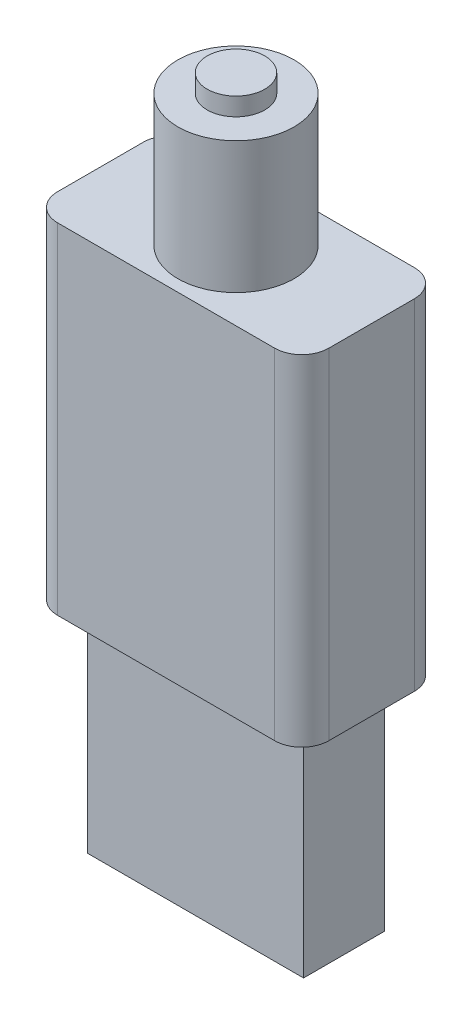
ISO-10303-21;
HEADER;
FILE_DESCRIPTION(('STEP AP214'),'2;1');
FILE_NAME('part.step','',(''),(''),'','','');
FILE_SCHEMA(('AUTOMOTIVE_DESIGN { 1 0 10303 214 1 1 1 1 }'));
ENDSEC;
DATA;
#1=APPLICATION_CONTEXT('core data for automotive mechanical design processes');
#2=APPLICATION_PROTOCOL_DEFINITION('international standard','automotive_design',2000,#1);
#3=PRODUCT_CONTEXT('',#1,'mechanical');
#4=PRODUCT('Part','Part','',(#3));
#5=PRODUCT_RELATED_PRODUCT_CATEGORY('part','',(#4));
#6=PRODUCT_DEFINITION_FORMATION('','',#4);
#7=PRODUCT_DEFINITION_CONTEXT('part definition',#1,'design');
#8=PRODUCT_DEFINITION('design','',#6,#7);
#9=PRODUCT_DEFINITION_SHAPE('','',#8);
#10=(LENGTH_UNIT() NAMED_UNIT(*) SI_UNIT(.MILLI.,.METRE.));
#11=(NAMED_UNIT(*) PLANE_ANGLE_UNIT() SI_UNIT($,.RADIAN.));
#12=(NAMED_UNIT(*) SI_UNIT($,.STERADIAN.) SOLID_ANGLE_UNIT());
#13=UNCERTAINTY_MEASURE_WITH_UNIT(LENGTH_MEASURE(1.E-05),#10,'distance_accuracy_value','');
#14=(GEOMETRIC_REPRESENTATION_CONTEXT(3) GLOBAL_UNCERTAINTY_ASSIGNED_CONTEXT((#13)) GLOBAL_UNIT_ASSIGNED_CONTEXT((#10,
#11,#12)) REPRESENTATION_CONTEXT('',''));
#15=CARTESIAN_POINT('',(0.,0.,0.));
#16=DIRECTION('',(0.,0.,1.));
#17=DIRECTION('',(1.,0.,0.));
#18=AXIS2_PLACEMENT_3D('',#15,#16,#17);
#19=CARTESIAN_POINT('',(6.,12.23,2.25));
#20=DIRECTION('',(-1.,0.,0.));
#21=DIRECTION('',(0.,0.,1.));
#22=AXIS2_PLACEMENT_3D('',#19,#20,#21);
#23=PLANE('',#22);
#24=DIRECTION('',(0.,0.,-1.));
#25=VECTOR('',#24,1.);
#26=CARTESIAN_POINT('',(6.,0.,2.25));
#27=LINE('',#26,#25);
#28=CARTESIAN_POINT('',(6.,0.,2.25));
#29=VERTEX_POINT('',#28);
#30=CARTESIAN_POINT('',(6.,0.,-2.25));
#31=VERTEX_POINT('',#30);
#32=EDGE_CURVE('E156',#29,#31,#27,.T.);
#33=ORIENTED_EDGE('',*,*,#32,.T.);
#34=DIRECTION('',(0.,-1.,0.));
#35=VECTOR('',#34,1.);
#36=CARTESIAN_POINT('',(6.,12.23,-2.25));
#37=LINE('',#36,#35);
#38=CARTESIAN_POINT('',(6.,12.23,-2.25));
#39=VERTEX_POINT('',#38);
#40=EDGE_CURVE('E182',#39,#31,#37,.T.);
#41=ORIENTED_EDGE('',*,*,#40,.F.);
#42=DIRECTION('',(0.,0.,-1.));
#43=VECTOR('',#42,1.);
#44=CARTESIAN_POINT('',(6.,12.23,2.25));
#45=LINE('',#44,#43);
#46=CARTESIAN_POINT('',(6.,12.23,2.25));
#47=VERTEX_POINT('',#46);
#48=EDGE_CURVE('E165',#47,#39,#45,.T.);
#49=ORIENTED_EDGE('',*,*,#48,.F.);
#50=DIRECTION('',(0.,-1.,0.));
#51=VECTOR('',#50,1.);
#52=CARTESIAN_POINT('',(6.,12.23,2.25));
#53=LINE('',#52,#51);
#54=EDGE_CURVE('E174',#47,#29,#53,.T.);
#55=ORIENTED_EDGE('',*,*,#54,.T.);
#56=EDGE_LOOP('',(#33,#41,#49,#55));
#57=FACE_BOUND('',#56,.T.);
#58=ADVANCED_FACE('F32',(#57),#23,.F.);
#59=CARTESIAN_POINT('',(-6.,12.23,-2.25));
#60=DIRECTION('',(0.,0.,1.));
#61=DIRECTION('',(1.,0.,0.));
#62=AXIS2_PLACEMENT_3D('',#59,#60,#61);
#63=PLANE('',#62);
#64=DIRECTION('',(-1.,0.,0.));
#65=VECTOR('',#64,1.);
#66=CARTESIAN_POINT('',(-6.,0.,-2.25));
#67=LINE('',#66,#65);
#68=CARTESIAN_POINT('',(-6.,0.,-2.25));
#69=VERTEX_POINT('',#68);
#70=EDGE_CURVE('E159',#31,#69,#67,.T.);
#71=ORIENTED_EDGE('',*,*,#70,.T.);
#72=DIRECTION('',(0.,-1.,0.));
#73=VECTOR('',#72,1.);
#74=CARTESIAN_POINT('',(-6.,12.23,-2.25));
#75=LINE('',#74,#73);
#76=CARTESIAN_POINT('',(-6.,12.23,-2.25));
#77=VERTEX_POINT('',#76);
#78=EDGE_CURVE('E181',#77,#69,#75,.T.);
#79=ORIENTED_EDGE('',*,*,#78,.F.);
#80=DIRECTION('',(-1.,0.,0.));
#81=VECTOR('',#80,1.);
#82=CARTESIAN_POINT('',(-6.,12.23,-2.25));
#83=LINE('',#82,#81);
#84=EDGE_CURVE('E76',#39,#77,#83,.T.);
#85=ORIENTED_EDGE('',*,*,#84,.F.);
#86=ORIENTED_EDGE('',*,*,#40,.T.);
#87=EDGE_LOOP('',(#71,#79,#85,#86));
#88=FACE_BOUND('',#87,.T.);
#89=ADVANCED_FACE('F203',(#88),#63,.F.);
#90=CARTESIAN_POINT('',(-6.,12.23,2.25));
#91=DIRECTION('',(1.,0.,0.));
#92=DIRECTION('',(0.,0.,-1.));
#93=AXIS2_PLACEMENT_3D('',#90,#91,#92);
#94=PLANE('',#93);
#95=DIRECTION('',(0.,0.,1.));
#96=VECTOR('',#95,1.);
#97=CARTESIAN_POINT('',(-6.,0.,2.25));
#98=LINE('',#97,#96);
#99=CARTESIAN_POINT('',(-6.,0.,2.25));
#100=VERTEX_POINT('',#99);
#101=EDGE_CURVE('E65',#69,#100,#98,.T.);
#102=ORIENTED_EDGE('',*,*,#101,.T.);
#103=DIRECTION('',(0.,-1.,0.));
#104=VECTOR('',#103,1.);
#105=CARTESIAN_POINT('',(-6.,12.23,2.25));
#106=LINE('',#105,#104);
#107=CARTESIAN_POINT('',(-6.,12.23,2.25));
#108=VERTEX_POINT('',#107);
#109=EDGE_CURVE('E49',#108,#100,#106,.T.);
#110=ORIENTED_EDGE('',*,*,#109,.F.);
#111=DIRECTION('',(0.,0.,1.));
#112=VECTOR('',#111,1.);
#113=CARTESIAN_POINT('',(-6.,12.23,2.25));
#114=LINE('',#113,#112);
#115=EDGE_CURVE('E169',#77,#108,#114,.T.);
#116=ORIENTED_EDGE('',*,*,#115,.F.);
#117=ORIENTED_EDGE('',*,*,#78,.T.);
#118=EDGE_LOOP('',(#102,#110,#116,#117));
#119=FACE_BOUND('',#118,.T.);
#120=ADVANCED_FACE('F208',(#119),#94,.F.);
#121=CARTESIAN_POINT('',(-6.,12.23,2.25));
#122=DIRECTION('',(0.,0.,-1.));
#123=DIRECTION('',(-1.,0.,0.));
#124=AXIS2_PLACEMENT_3D('',#121,#122,#123);
#125=PLANE('',#124);
#126=DIRECTION('',(1.,0.,0.));
#127=VECTOR('',#126,1.);
#128=CARTESIAN_POINT('',(-6.,0.,2.25));
#129=LINE('',#128,#127);
#130=EDGE_CURVE('E70',#100,#29,#129,.T.);
#131=ORIENTED_EDGE('',*,*,#130,.T.);
#132=ORIENTED_EDGE('',*,*,#54,.F.);
#133=DIRECTION('',(1.,0.,0.));
#134=VECTOR('',#133,1.);
#135=CARTESIAN_POINT('',(-6.,12.23,2.25));
#136=LINE('',#135,#134);
#137=EDGE_CURVE('E172',#108,#47,#136,.T.);
#138=ORIENTED_EDGE('',*,*,#137,.F.);
#139=ORIENTED_EDGE('',*,*,#109,.T.);
#140=EDGE_LOOP('',(#131,#132,#138,#139));
#141=FACE_BOUND('',#140,.T.);
#142=ADVANCED_FACE('F213',(#141),#125,.F.);
#143=CARTESIAN_POINT('',(0.,0.,0.));
#144=DIRECTION('',(0.,-1.,0.));
#145=DIRECTION('',(0.,0.,-1.));
#146=AXIS2_PLACEMENT_3D('',#143,#144,#145);
#147=PLANE('',#146);
#148=ORIENTED_EDGE('',*,*,#32,.F.);
#149=ORIENTED_EDGE('',*,*,#130,.F.);
#150=ORIENTED_EDGE('',*,*,#101,.F.);
#151=ORIENTED_EDGE('',*,*,#70,.F.);
#152=EDGE_LOOP('',(#148,#149,#150,#151));
#153=FACE_BOUND('',#152,.T.);
#154=ADVANCED_FACE('F211',(#153),#147,.T.);
#155=CARTESIAN_POINT('',(-6.025,31.1,2.375));
#156=DIRECTION('',(0.,-1.,0.));
#157=DIRECTION('',(0.,0.,-1.));
#158=AXIS2_PLACEMENT_3D('',#155,#156,#157);
#159=CYLINDRICAL_SURFACE('',#158,1.5);
#160=CARTESIAN_POINT('',(-6.025,12.23,2.375));
#161=DIRECTION('',(0.,1.,0.));
#162=DIRECTION('',(0.,0.,-1.));
#163=AXIS2_PLACEMENT_3D('',#160,#161,#162);
#164=CIRCLE('',#163,1.5);
#165=CARTESIAN_POINT('',(-7.525,12.23,2.37499999999999));
#166=VERTEX_POINT('',#165);
#167=CARTESIAN_POINT('',(-6.02499999999999,12.23,3.875));
#168=VERTEX_POINT('',#167);
#169=EDGE_CURVE('E155',#166,#168,#164,.T.);
#170=ORIENTED_EDGE('',*,*,#169,.T.);
#171=DIRECTION('',(0.,-1.,0.));
#172=VECTOR('',#171,1.);
#173=CARTESIAN_POINT('',(-6.02499999999999,31.1,3.875));
#174=LINE('',#173,#172);
#175=CARTESIAN_POINT('',(-6.02499999999999,31.1,3.875));
#176=VERTEX_POINT('',#175);
#177=EDGE_CURVE('E135',#176,#168,#174,.T.);
#178=ORIENTED_EDGE('',*,*,#177,.F.);
#179=CARTESIAN_POINT('',(-6.025,31.1,2.375));
#180=DIRECTION('',(0.,1.,0.));
#181=DIRECTION('',(0.,0.,-1.));
#182=AXIS2_PLACEMENT_3D('',#179,#180,#181);
#183=CIRCLE('',#182,1.5);
#184=CARTESIAN_POINT('',(-7.525,31.1,2.37499999999999));
#185=VERTEX_POINT('',#184);
#186=EDGE_CURVE('E142',#185,#176,#183,.T.);
#187=ORIENTED_EDGE('',*,*,#186,.F.);
#188=DIRECTION('',(0.,-1.,0.));
#189=VECTOR('',#188,1.);
#190=CARTESIAN_POINT('',(-7.525,31.1,2.37499999999999));
#191=LINE('',#190,#189);
#192=EDGE_CURVE('E260',#185,#166,#191,.T.);
#193=ORIENTED_EDGE('',*,*,#192,.T.);
#194=EDGE_LOOP('',(#170,#178,#187,#193));
#195=FACE_BOUND('',#194,.T.);
#196=ADVANCED_FACE('F153',(#195),#159,.T.);
#197=CARTESIAN_POINT('',(-6.02499999999999,31.1,3.875));
#198=DIRECTION('',(0.,0.,-1.));
#199=DIRECTION('',(-1.,0.,0.));
#200=AXIS2_PLACEMENT_3D('',#197,#198,#199);
#201=PLANE('',#200);
#202=DIRECTION('',(1.,0.,0.));
#203=VECTOR('',#202,1.);
#204=CARTESIAN_POINT('',(-6.02499999999999,12.23,3.875));
#205=LINE('',#204,#203);
#206=CARTESIAN_POINT('',(6.02499999999999,12.23,3.875));
#207=VERTEX_POINT('',#206);
#208=EDGE_CURVE('E285',#168,#207,#205,.T.);
#209=ORIENTED_EDGE('',*,*,#208,.T.);
#210=DIRECTION('',(0.,-1.,0.));
#211=VECTOR('',#210,1.);
#212=CARTESIAN_POINT('',(6.02499999999999,31.1,3.875));
#213=LINE('',#212,#211);
#214=CARTESIAN_POINT('',(6.02499999999999,31.1,3.875));
#215=VERTEX_POINT('',#214);
#216=EDGE_CURVE('E138',#215,#207,#213,.T.);
#217=ORIENTED_EDGE('',*,*,#216,.F.);
#218=DIRECTION('',(1.,0.,0.));
#219=VECTOR('',#218,1.);
#220=CARTESIAN_POINT('',(-6.02499999999999,31.1,3.875));
#221=LINE('',#220,#219);
#222=EDGE_CURVE('E131',#176,#215,#221,.T.);
#223=ORIENTED_EDGE('',*,*,#222,.F.);
#224=ORIENTED_EDGE('',*,*,#177,.T.);
#225=EDGE_LOOP('',(#209,#217,#223,#224));
#226=FACE_BOUND('',#225,.T.);
#227=ADVANCED_FACE('F133',(#226),#201,.F.);
#228=CARTESIAN_POINT('',(6.025,31.1,2.375));
#229=DIRECTION('',(0.,-1.,0.));
#230=DIRECTION('',(0.,0.,-1.));
#231=AXIS2_PLACEMENT_3D('',#228,#229,#230);
#232=CYLINDRICAL_SURFACE('',#231,1.5);
#233=CARTESIAN_POINT('',(6.025,12.23,2.375));
#234=DIRECTION('',(0.,1.,0.));
#235=DIRECTION('',(0.,0.,1.));
#236=AXIS2_PLACEMENT_3D('',#233,#234,#235);
#237=CIRCLE('',#236,1.5);
#238=CARTESIAN_POINT('',(7.525,12.23,2.37499999999999));
#239=VERTEX_POINT('',#238);
#240=EDGE_CURVE('E281',#207,#239,#237,.T.);
#241=ORIENTED_EDGE('',*,*,#240,.T.);
#242=DIRECTION('',(0.,-1.,0.));
#243=VECTOR('',#242,1.);
#244=CARTESIAN_POINT('',(7.525,31.1,2.37499999999999));
#245=LINE('',#244,#243);
#246=CARTESIAN_POINT('',(7.525,31.1,2.37499999999999));
#247=VERTEX_POINT('',#246);
#248=EDGE_CURVE('E161',#247,#239,#245,.T.);
#249=ORIENTED_EDGE('',*,*,#248,.F.);
#250=CARTESIAN_POINT('',(6.025,31.1,2.375));
#251=DIRECTION('',(0.,1.,0.));
#252=DIRECTION('',(0.,0.,1.));
#253=AXIS2_PLACEMENT_3D('',#250,#251,#252);
#254=CIRCLE('',#253,1.5);
#255=EDGE_CURVE('E141',#215,#247,#254,.T.);
#256=ORIENTED_EDGE('',*,*,#255,.F.);
#257=ORIENTED_EDGE('',*,*,#216,.T.);
#258=EDGE_LOOP('',(#241,#249,#256,#257));
#259=FACE_BOUND('',#258,.T.);
#260=ADVANCED_FACE('F227',(#259),#232,.T.);
#261=CARTESIAN_POINT('',(7.525,31.1,2.37499999999999));
#262=DIRECTION('',(-1.,0.,0.));
#263=DIRECTION('',(0.,0.,1.));
#264=AXIS2_PLACEMENT_3D('',#261,#262,#263);
#265=PLANE('',#264);
#266=DIRECTION('',(0.,0.,-1.));
#267=VECTOR('',#266,1.);
#268=CARTESIAN_POINT('',(7.525,12.23,2.37499999999999));
#269=LINE('',#268,#267);
#270=CARTESIAN_POINT('',(7.525,12.23,-2.37499999999999));
#271=VERTEX_POINT('',#270);
#272=EDGE_CURVE('E277',#239,#271,#269,.T.);
#273=ORIENTED_EDGE('',*,*,#272,.T.);
#274=DIRECTION('',(0.,-1.,0.));
#275=VECTOR('',#274,1.);
#276=CARTESIAN_POINT('',(7.525,31.1,-2.37499999999999));
#277=LINE('',#276,#275);
#278=CARTESIAN_POINT('',(7.525,31.1,-2.37499999999999));
#279=VERTEX_POINT('',#278);
#280=EDGE_CURVE('E270',#279,#271,#277,.T.);
#281=ORIENTED_EDGE('',*,*,#280,.F.);
#282=DIRECTION('',(0.,0.,-1.));
#283=VECTOR('',#282,1.);
#284=CARTESIAN_POINT('',(7.525,31.1,2.37499999999999));
#285=LINE('',#284,#283);
#286=EDGE_CURVE('E278',#247,#279,#285,.T.);
#287=ORIENTED_EDGE('',*,*,#286,.F.);
#288=ORIENTED_EDGE('',*,*,#248,.T.);
#289=EDGE_LOOP('',(#273,#281,#287,#288));
#290=FACE_BOUND('',#289,.T.);
#291=ADVANCED_FACE('F230',(#290),#265,.F.);
#292=CARTESIAN_POINT('',(6.025,31.1,-2.375));
#293=DIRECTION('',(0.,-1.,0.));
#294=DIRECTION('',(0.,0.,-1.));
#295=AXIS2_PLACEMENT_3D('',#292,#293,#294);
#296=CYLINDRICAL_SURFACE('',#295,1.5);
#297=CARTESIAN_POINT('',(6.025,12.23,-2.375));
#298=DIRECTION('',(0.,1.,0.));
#299=DIRECTION('',(0.,0.,-1.));
#300=AXIS2_PLACEMENT_3D('',#297,#298,#299);
#301=CIRCLE('',#300,1.5);
#302=CARTESIAN_POINT('',(6.02499999999999,12.23,-3.875));
#303=VERTEX_POINT('',#302);
#304=EDGE_CURVE('E282',#271,#303,#301,.T.);
#305=ORIENTED_EDGE('',*,*,#304,.T.);
#306=DIRECTION('',(0.,-1.,0.));
#307=VECTOR('',#306,1.);
#308=CARTESIAN_POINT('',(6.02499999999999,31.1,-3.875));
#309=LINE('',#308,#307);
#310=CARTESIAN_POINT('',(6.02499999999999,31.1,-3.875));
#311=VERTEX_POINT('',#310);
#312=EDGE_CURVE('E267',#311,#303,#309,.T.);
#313=ORIENTED_EDGE('',*,*,#312,.F.);
#314=CARTESIAN_POINT('',(6.025,31.1,-2.375));
#315=DIRECTION('',(0.,1.,0.));
#316=DIRECTION('',(0.,0.,-1.));
#317=AXIS2_PLACEMENT_3D('',#314,#315,#316);
#318=CIRCLE('',#317,1.5);
#319=EDGE_CURVE('E292',#279,#311,#318,.T.);
#320=ORIENTED_EDGE('',*,*,#319,.F.);
#321=ORIENTED_EDGE('',*,*,#280,.T.);
#322=EDGE_LOOP('',(#305,#313,#320,#321));
#323=FACE_BOUND('',#322,.T.);
#324=ADVANCED_FACE('F234',(#323),#296,.T.);
#325=CARTESIAN_POINT('',(-6.02499999999999,31.1,-3.875));
#326=DIRECTION('',(0.,0.,1.));
#327=DIRECTION('',(1.,0.,0.));
#328=AXIS2_PLACEMENT_3D('',#325,#326,#327);
#329=PLANE('',#328);
#330=DIRECTION('',(-1.,0.,0.));
#331=VECTOR('',#330,1.);
#332=CARTESIAN_POINT('',(-6.02499999999999,12.23,-3.875));
#333=LINE('',#332,#331);
#334=CARTESIAN_POINT('',(-6.02499999999999,12.23,-3.875));
#335=VERTEX_POINT('',#334);
#336=EDGE_CURVE('E258',#303,#335,#333,.T.);
#337=ORIENTED_EDGE('',*,*,#336,.T.);
#338=DIRECTION('',(0.,-1.,0.));
#339=VECTOR('',#338,1.);
#340=CARTESIAN_POINT('',(-6.02499999999999,31.1,-3.875));
#341=LINE('',#340,#339);
#342=CARTESIAN_POINT('',(-6.02499999999999,31.1,-3.875));
#343=VERTEX_POINT('',#342);
#344=EDGE_CURVE('E255',#343,#335,#341,.T.);
#345=ORIENTED_EDGE('',*,*,#344,.F.);
#346=DIRECTION('',(-1.,0.,0.));
#347=VECTOR('',#346,1.);
#348=CARTESIAN_POINT('',(-6.02499999999999,31.1,-3.875));
#349=LINE('',#348,#347);
#350=EDGE_CURVE('E290',#311,#343,#349,.T.);
#351=ORIENTED_EDGE('',*,*,#350,.F.);
#352=ORIENTED_EDGE('',*,*,#312,.T.);
#353=EDGE_LOOP('',(#337,#345,#351,#352));
#354=FACE_BOUND('',#353,.T.);
#355=ADVANCED_FACE('F238',(#354),#329,.F.);
#356=CARTESIAN_POINT('',(-6.025,31.1,-2.375));
#357=DIRECTION('',(0.,-1.,0.));
#358=DIRECTION('',(0.,0.,-1.));
#359=AXIS2_PLACEMENT_3D('',#356,#357,#358);
#360=CYLINDRICAL_SURFACE('',#359,1.5);
#361=CARTESIAN_POINT('',(-6.025,12.23,-2.375));
#362=DIRECTION('',(0.,1.,0.));
#363=DIRECTION('',(0.,0.,-1.));
#364=AXIS2_PLACEMENT_3D('',#361,#362,#363);
#365=CIRCLE('',#364,1.5);
#366=CARTESIAN_POINT('',(-7.525,12.23,-2.37499999999999));
#367=VERTEX_POINT('',#366);
#368=EDGE_CURVE('E250',#335,#367,#365,.T.);
#369=ORIENTED_EDGE('',*,*,#368,.T.);
#370=DIRECTION('',(0.,-1.,0.));
#371=VECTOR('',#370,1.);
#372=CARTESIAN_POINT('',(-7.525,31.1,-2.37499999999999));
#373=LINE('',#372,#371);
#374=CARTESIAN_POINT('',(-7.525,31.1,-2.37499999999999));
#375=VERTEX_POINT('',#374);
#376=EDGE_CURVE('E253',#375,#367,#373,.T.);
#377=ORIENTED_EDGE('',*,*,#376,.F.);
#378=CARTESIAN_POINT('',(-6.025,31.1,-2.375));
#379=DIRECTION('',(0.,1.,0.));
#380=DIRECTION('',(0.,0.,-1.));
#381=AXIS2_PLACEMENT_3D('',#378,#379,#380);
#382=CIRCLE('',#381,1.5);
#383=EDGE_CURVE('E294',#343,#375,#382,.T.);
#384=ORIENTED_EDGE('',*,*,#383,.F.);
#385=ORIENTED_EDGE('',*,*,#344,.T.);
#386=EDGE_LOOP('',(#369,#377,#384,#385));
#387=FACE_BOUND('',#386,.T.);
#388=ADVANCED_FACE('F198',(#387),#360,.T.);
#389=CARTESIAN_POINT('',(-7.525,31.1,2.37499999999999));
#390=DIRECTION('',(1.,0.,0.));
#391=DIRECTION('',(0.,0.,-1.));
#392=AXIS2_PLACEMENT_3D('',#389,#390,#391);
#393=PLANE('',#392);
#394=DIRECTION('',(0.,0.,1.));
#395=VECTOR('',#394,1.);
#396=CARTESIAN_POINT('',(-7.525,12.23,2.37499999999999));
#397=LINE('',#396,#395);
#398=EDGE_CURVE('E151',#367,#166,#397,.T.);
#399=ORIENTED_EDGE('',*,*,#398,.T.);
#400=ORIENTED_EDGE('',*,*,#192,.F.);
#401=DIRECTION('',(0.,0.,1.));
#402=VECTOR('',#401,1.);
#403=CARTESIAN_POINT('',(-7.525,31.1,2.37499999999999));
#404=LINE('',#403,#402);
#405=EDGE_CURVE('E147',#375,#185,#404,.T.);
#406=ORIENTED_EDGE('',*,*,#405,.F.);
#407=ORIENTED_EDGE('',*,*,#376,.T.);
#408=EDGE_LOOP('',(#399,#400,#406,#407));
#409=FACE_BOUND('',#408,.T.);
#410=ADVANCED_FACE('F190',(#409),#393,.F.);
#411=CARTESIAN_POINT('',(-6.025,31.1,2.375));
#412=DIRECTION('',(0.,-1.,0.));
#413=DIRECTION('',(0.,0.,-1.));
#414=AXIS2_PLACEMENT_3D('',#411,#412,#413);
#415=PLANE('',#414);
#416=CARTESIAN_POINT('',(0.,31.1,0.));
#417=DIRECTION('',(0.,-1.,0.));
#418=DIRECTION('',(0.,0.,-1.));
#419=AXIS2_PLACEMENT_3D('',#416,#417,#418);
#420=CIRCLE('',#419,3.225);
#421=CARTESIAN_POINT('',(0.,31.1,-3.225));
#422=VERTEX_POINT('',#421);
#423=EDGE_CURVE('E35',#422,#422,#420,.F.);
#424=ORIENTED_EDGE('',*,*,#423,.F.);
#425=EDGE_LOOP('',(#424));
#426=FACE_BOUND('',#425,.T.);
#427=ORIENTED_EDGE('',*,*,#186,.T.);
#428=ORIENTED_EDGE('',*,*,#222,.T.);
#429=ORIENTED_EDGE('',*,*,#255,.T.);
#430=ORIENTED_EDGE('',*,*,#286,.T.);
#431=ORIENTED_EDGE('',*,*,#319,.T.);
#432=ORIENTED_EDGE('',*,*,#350,.T.);
#433=ORIENTED_EDGE('',*,*,#383,.T.);
#434=ORIENTED_EDGE('',*,*,#405,.T.);
#435=EDGE_LOOP('',(#427,#428,#429,#430,#431,#432,#433,#434));
#436=FACE_BOUND('',#435,.T.);
#437=ADVANCED_FACE('F145',(#426,#436),#415,.F.);
#438=CARTESIAN_POINT('',(-6.025,12.23,2.375));
#439=DIRECTION('',(0.,-1.,0.));
#440=DIRECTION('',(0.,0.,-1.));
#441=AXIS2_PLACEMENT_3D('',#438,#439,#440);
#442=PLANE('',#441);
#443=ORIENTED_EDGE('',*,*,#137,.T.);
#444=ORIENTED_EDGE('',*,*,#48,.T.);
#445=ORIENTED_EDGE('',*,*,#84,.T.);
#446=ORIENTED_EDGE('',*,*,#115,.T.);
#447=EDGE_LOOP('',(#443,#444,#445,#446));
#448=FACE_BOUND('',#447,.T.);
#449=ORIENTED_EDGE('',*,*,#169,.F.);
#450=ORIENTED_EDGE('',*,*,#398,.F.);
#451=ORIENTED_EDGE('',*,*,#368,.F.);
#452=ORIENTED_EDGE('',*,*,#336,.F.);
#453=ORIENTED_EDGE('',*,*,#304,.F.);
#454=ORIENTED_EDGE('',*,*,#272,.F.);
#455=ORIENTED_EDGE('',*,*,#240,.F.);
#456=ORIENTED_EDGE('',*,*,#208,.F.);
#457=EDGE_LOOP('',(#449,#450,#451,#452,#453,#454,#455,#456));
#458=FACE_BOUND('',#457,.T.);
#459=ADVANCED_FACE('F189',(#448,#458),#442,.T.);
#460=CARTESIAN_POINT('',(0.,38.4,0.));
#461=DIRECTION('',(0.,-1.,0.));
#462=DIRECTION('',(0.,0.,-1.));
#463=AXIS2_PLACEMENT_3D('',#460,#461,#462);
#464=CYLINDRICAL_SURFACE('',#463,3.225);
#465=CARTESIAN_POINT('',(0.,38.4,0.));
#466=DIRECTION('',(0.,1.,0.));
#467=DIRECTION('',(0.,0.,1.));
#468=AXIS2_PLACEMENT_3D('',#465,#466,#467);
#469=CIRCLE('',#468,3.225);
#470=CARTESIAN_POINT('',(0.,38.4,3.225));
#471=VERTEX_POINT('',#470);
#472=EDGE_CURVE('E301',#471,#471,#469,.T.);
#473=ORIENTED_EDGE('',*,*,#472,.F.);
#474=EDGE_LOOP('',(#473));
#475=FACE_BOUND('',#474,.T.);
#476=ORIENTED_EDGE('',*,*,#423,.T.);
#477=EDGE_LOOP('',(#476));
#478=FACE_BOUND('',#477,.T.);
#479=ADVANCED_FACE('F186',(#475,#478),#464,.T.);
#480=CARTESIAN_POINT('',(0.,38.4,0.));
#481=DIRECTION('',(0.,1.,0.));
#482=DIRECTION('',(0.,0.,1.));
#483=AXIS2_PLACEMENT_3D('',#480,#481,#482);
#484=PLANE('',#483);
#485=CARTESIAN_POINT('',(0.,38.4,0.));
#486=DIRECTION('',(0.,1.,0.));
#487=DIRECTION('',(0.,0.,1.));
#488=AXIS2_PLACEMENT_3D('',#485,#486,#487);
#489=CIRCLE('',#488,1.6);
#490=CARTESIAN_POINT('',(0.,38.4,1.6));
#491=VERTEX_POINT('',#490);
#492=EDGE_CURVE('E11',#491,#491,#489,.T.);
#493=ORIENTED_EDGE('',*,*,#492,.F.);
#494=EDGE_LOOP('',(#493));
#495=FACE_BOUND('',#494,.T.);
#496=ORIENTED_EDGE('',*,*,#472,.T.);
#497=EDGE_LOOP('',(#496));
#498=FACE_BOUND('',#497,.T.);
#499=ADVANCED_FACE('F314',(#495,#498),#484,.T.);
#500=CARTESIAN_POINT('',(0.,39.4,0.));
#501=DIRECTION('',(0.,-1.,0.));
#502=DIRECTION('',(0.,0.,-1.));
#503=AXIS2_PLACEMENT_3D('',#500,#501,#502);
#504=CYLINDRICAL_SURFACE('',#503,1.6);
#505=CARTESIAN_POINT('',(0.,39.4,0.));
#506=DIRECTION('',(0.,1.,0.));
#507=DIRECTION('',(0.,0.,1.));
#508=AXIS2_PLACEMENT_3D('',#505,#506,#507);
#509=CIRCLE('',#508,1.6);
#510=CARTESIAN_POINT('',(0.,39.4,1.6));
#511=VERTEX_POINT('',#510);
#512=EDGE_CURVE('E304',#511,#511,#509,.T.);
#513=ORIENTED_EDGE('',*,*,#512,.F.);
#514=EDGE_LOOP('',(#513));
#515=FACE_BOUND('',#514,.T.);
#516=ORIENTED_EDGE('',*,*,#492,.T.);
#517=EDGE_LOOP('',(#516));
#518=FACE_BOUND('',#517,.T.);
#519=ADVANCED_FACE('F311',(#515,#518),#504,.T.);
#520=CARTESIAN_POINT('',(0.,39.4,0.));
#521=DIRECTION('',(0.,1.,0.));
#522=DIRECTION('',(0.,0.,1.));
#523=AXIS2_PLACEMENT_3D('',#520,#521,#522);
#524=PLANE('',#523);
#525=ORIENTED_EDGE('',*,*,#512,.T.);
#526=EDGE_LOOP('',(#525));
#527=FACE_BOUND('',#526,.T.);
#528=ADVANCED_FACE('F309',(#527),#524,.T.);
#529=CLOSED_SHELL('',(#58,#89,#120,#142,#154,#196,#227,#260,#291,#324,#355,#388,#410,#437,#459,
#479,#499,#519,#528));
#530=MANIFOLD_SOLID_BREP('B2',#529);
#531=ADVANCED_BREP_SHAPE_REPRESENTATION('',(#18,#530),#14);
#532=SHAPE_DEFINITION_REPRESENTATION(#9,#531);
ENDSEC;
END-ISO-10303-21;
